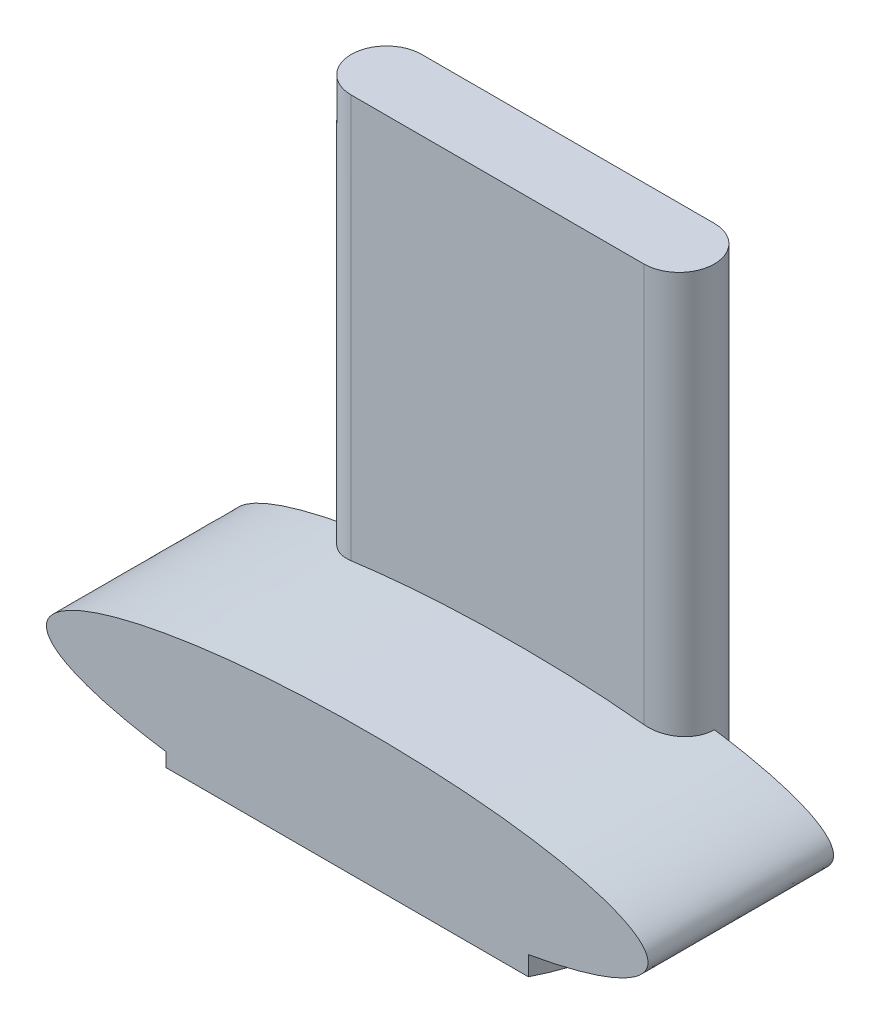
ISO-10303-21;
HEADER;
FILE_DESCRIPTION(('STEP AP214'),'2;1');
FILE_NAME('part.step','',(''),(''),'','','');
FILE_SCHEMA(('AUTOMOTIVE_DESIGN { 1 0 10303 214 1 1 1 1 }'));
ENDSEC;
DATA;
#1=APPLICATION_CONTEXT('core data for automotive mechanical design processes');
#2=APPLICATION_PROTOCOL_DEFINITION('international standard','automotive_design',2000,#1);
#3=PRODUCT_CONTEXT('',#1,'mechanical');
#4=PRODUCT('Part','Part','',(#3));
#5=PRODUCT_RELATED_PRODUCT_CATEGORY('part','',(#4));
#6=PRODUCT_DEFINITION_FORMATION('','',#4);
#7=PRODUCT_DEFINITION_CONTEXT('part definition',#1,'design');
#8=PRODUCT_DEFINITION('design','',#6,#7);
#9=PRODUCT_DEFINITION_SHAPE('','',#8);
#10=(LENGTH_UNIT() NAMED_UNIT(*) SI_UNIT(.MILLI.,.METRE.));
#11=(NAMED_UNIT(*) PLANE_ANGLE_UNIT() SI_UNIT($,.RADIAN.));
#12=(NAMED_UNIT(*) SI_UNIT($,.STERADIAN.) SOLID_ANGLE_UNIT());
#13=UNCERTAINTY_MEASURE_WITH_UNIT(LENGTH_MEASURE(1.E-05),#10,'distance_accuracy_value','');
#14=(GEOMETRIC_REPRESENTATION_CONTEXT(3) GLOBAL_UNCERTAINTY_ASSIGNED_CONTEXT((#13)) GLOBAL_UNIT_ASSIGNED_CONTEXT((#10,
#11,#12)) REPRESENTATION_CONTEXT('',''));
#15=CARTESIAN_POINT('',(0.,0.,0.));
#16=DIRECTION('',(0.,0.,1.));
#17=DIRECTION('',(1.,0.,0.));
#18=AXIS2_PLACEMENT_3D('',#15,#16,#17);
#19=CARTESIAN_POINT('',(-67.802373163856,6.57126359990257,29.));
#20=DIRECTION('',(0.,0.,1.));
#21=DIRECTION('',(0.999874210154372,0.015860765056315,0.));
#22=AXIS2_PLACEMENT_3D('',#19,#20,#21);
#23=ELLIPSE('',#22,47.0059128665231,10.001258056707);
#24=DIRECTION('',(0.,0.,-1.));
#25=VECTOR('',#24,1.);
#26=SURFACE_OF_LINEAR_EXTRUSION('',#23,#25);
#27=CARTESIAN_POINT('',(-67.802373163856,6.57126359990257,0.));
#28=DIRECTION('',(0.,0.,1.));
#29=DIRECTION('',(0.999874210154372,0.015860765056315,0.));
#30=AXIS2_PLACEMENT_3D('',#27,#28,#29);
#31=ELLIPSE('',#30,47.0059128665231,10.001258056707);
#32=CARTESIAN_POINT('',(-39.4963550923296,-0.985077744393621,0.));
#33=VERTEX_POINT('',#32);
#34=CARTESIAN_POINT('',(-39.4323803621719,14.9756447772538,0.));
#35=VERTEX_POINT('',#34);
#36=EDGE_CURVE('E209',#33,#35,#31,.T.);
#37=ORIENTED_EDGE('',*,*,#36,.T.);
#38=CARTESIAN_POINT('',(-39.4323803621719,14.9756447772538,0.));
#39=CARTESIAN_POINT('',(-39.4323628763597,14.9756398915962,0.1536177940177));
#40=CARTESIAN_POINT('',(-39.4388158718519,14.9765841507698,0.307232402073417));
#41=CARTESIAN_POINT('',(-39.4645360192316,14.9803355381872,0.613351089704219));
#42=CARTESIAN_POINT('',(-39.4838022098335,14.9831425266833,0.765855251720767));
#43=CARTESIAN_POINT('',(-39.5349938035824,14.9905798689408,1.06850570471066));
#44=CARTESIAN_POINT('',(-39.5669052573059,14.9952082134631,1.21865440496776));
#45=CARTESIAN_POINT('',(-39.6431414246942,15.0062200996859,1.51569908695471));
#46=CARTESIAN_POINT('',(-39.6874660543734,15.0126036295111,1.66259509068451));
#47=CARTESIAN_POINT('',(-39.7882068157047,15.0270370882057,1.95212230248194));
#48=CARTESIAN_POINT('',(-39.8446248952141,15.0350872855133,2.09475281929768));
#49=CARTESIAN_POINT('',(-39.9691530269713,15.0527451245116,2.37477749467878));
#50=CARTESIAN_POINT('',(-40.0372673935081,15.0623533408195,2.51216969810749));
#51=CARTESIAN_POINT('',(-40.184641400445,15.0829909663263,2.78064754877124));
#52=CARTESIAN_POINT('',(-40.2638960517047,15.0940197391496,2.9117359840493));
#53=CARTESIAN_POINT('',(-40.4330308520631,15.1173622329959,3.16681717390972));
#54=CARTESIAN_POINT('',(-40.5229149308546,15.1296764290405,3.29080727894415));
#55=CARTESIAN_POINT('',(-40.7131184303007,15.1554961189407,3.53139598410666));
#56=CARTESIAN_POINT('',(-40.8134880000321,15.1690072860112,3.64795432820888));
#57=CARTESIAN_POINT('',(-41.0236042780639,15.1970073462977,3.87223656767038));
#58=CARTESIAN_POINT('',(-41.1333542340609,15.2114965777732,3.97995737777545));
#59=CARTESIAN_POINT('',(-41.3614281948898,15.2412797147566,4.18578989705671));
#60=CARTESIAN_POINT('',(-41.4797525180193,15.256573650131,4.2839012491924));
#61=CARTESIAN_POINT('',(-41.7241411165379,15.2877952188973,4.46984529409507));
#62=CARTESIAN_POINT('',(-41.8502054578212,15.3037228576837,4.55767789933602));
#63=CARTESIAN_POINT('',(-42.1104006980702,15.3361934658205,4.72323572714627));
#64=CARTESIAN_POINT('',(-42.2445957068343,15.3527407798355,4.80085936648686));
#65=CARTESIAN_POINT('',(-42.5189791424371,15.3861340986382,4.94446857374388));
#66=CARTESIAN_POINT('',(-42.6591655602181,15.4029800022101,5.01045800542338));
#67=CARTESIAN_POINT('',(-42.9445604191956,15.4368103091887,5.13035917651596));
#68=CARTESIAN_POINT('',(-43.0897675984394,15.4537946769844,5.18427392575244));
#69=CARTESIAN_POINT('',(-43.3841548643923,15.4877457078569,5.27965694503957));
#70=CARTESIAN_POINT('',(-43.5333340538545,15.5047123740473,5.32112800048769));
#71=CARTESIAN_POINT('',(-43.888480846632,15.5445212108886,5.40387177639771));
#72=CARTESIAN_POINT('',(-44.095737951612,15.5673021629479,5.43980551328131));
#73=CARTESIAN_POINT('',(-44.4084731660432,15.6009877941238,5.47574726039013));
#74=CARTESIAN_POINT('',(-44.5129791988911,15.6121304815873,5.48473468892212));
#75=CARTESIAN_POINT('',(-44.722345548559,15.6342272655959,5.49672274895402));
#76=CARTESIAN_POINT('',(-44.8272058365812,15.6451813770493,5.49972385589009));
#77=CARTESIAN_POINT('',(-44.9321054761412,15.6560269402788,5.49972511396923));
#78=B_SPLINE_CURVE_WITH_KNOTS('',3,(#38,#39,#40,#41,#42,#43,#44,#45,#46,#47,#48,#49,#50,#51,#52,
#53,#54,#55,#56,#57,#58,#59,#60,#61,#62,#63,#64,#65,#66,#67,#68,#69,#70,#71,#72,#73,#74,#75,#76,
#77),.UNSPECIFIED.,.F.,.F.,(4,2,2,2,2,2,2,2,2,2,2,2,2,2,2,2,2,2,2,4),(0.,0.460710364159492,
0.921386168302653,1.38155519360577,1.84172110555541,2.30196119087898,2.7623714063315,
3.22257608164276,3.68295142937163,4.14563925104148,4.60848791942732,5.07135377848889,
5.53422357867911,6.00139759208489,6.46841616182551,6.93531818922261,7.40211562713205,
8.03528914148741,8.35159222295398,8.66787018249702),.UNSPECIFIED.);
#79=CARTESIAN_POINT('',(-44.9321054761412,15.6560269402788,5.49972511396923));
#80=VERTEX_POINT('',#79);
#81=EDGE_CURVE('E157',#35,#80,#78,.T.);
#82=ORIENTED_EDGE('',*,*,#81,.T.);
#83=CARTESIAN_POINT('',(-67.802373163856,6.57126359990257,5.49972511396924));
#84=DIRECTION('',(0.,0.,1.));
#85=DIRECTION('',(0.999874210154372,0.015860765056315,0.));
#86=AXIS2_PLACEMENT_3D('',#83,#84,#85);
#87=ELLIPSE('',#86,47.0059128665231,10.001258056707);
#88=CARTESIAN_POINT('',(-90.6726408515708,14.9633098128657,5.49972511396923));
#89=VERTEX_POINT('',#88);
#90=EDGE_CURVE('E11',#80,#89,#87,.T.);
#91=ORIENTED_EDGE('',*,*,#90,.T.);
#92=CARTESIAN_POINT('',(-90.6726408515707,14.9633098128657,5.49972511396923));
#93=CARTESIAN_POINT('',(-90.8287894917864,14.942438240365,5.49974106665658));
#94=CARTESIAN_POINT('',(-90.9849014069268,14.9213182575938,5.49307573674945));
#95=CARTESIAN_POINT('',(-91.2959409542856,14.8787391772076,5.46651511223668));
#96=CARTESIAN_POINT('',(-91.4508686502114,14.8572800980283,5.44662053446519));
#97=CARTESIAN_POINT('',(-91.7583511452549,14.8141915392567,5.39375031243677));
#98=CARTESIAN_POINT('',(-91.9109073502225,14.7925621730384,5.36078275128843));
#99=CARTESIAN_POINT('',(-92.2126648250226,14.7492913581343,5.28200858226579));
#100=CARTESIAN_POINT('',(-92.3618661241227,14.7276499095556,5.23620208644296));
#101=CARTESIAN_POINT('',(-92.655899888991,14.684529743664,5.13205544856516));
#102=CARTESIAN_POINT('',(-92.8007311398658,14.6630510728245,5.07371185709269));
#103=CARTESIAN_POINT('',(-93.0850067426607,14.620445225195,4.94487901203998));
#104=CARTESIAN_POINT('',(-93.2244490897679,14.5993181808522,4.8743852905437));
#105=CARTESIAN_POINT('',(-93.4968223213544,14.5576331969927,4.72179311461037));
#106=CARTESIAN_POINT('',(-93.6297566601865,14.5370749581388,4.63970090840239));
#107=CARTESIAN_POINT('',(-93.888284334304,14.4967121784314,4.46441618501942));
#108=CARTESIAN_POINT('',(-94.0138751167907,14.4769079004978,4.37121984157477));
#109=CARTESIAN_POINT('',(-94.2565407928738,14.4383010199571,4.17456400861228));
#110=CARTESIAN_POINT('',(-94.3736302619677,14.4194967184524,4.07112284017423));
#111=CARTESIAN_POINT('',(-94.5986778617724,14.3830578605448,3.85455525677086));
#112=CARTESIAN_POINT('',(-94.7066360836598,14.3654232924624,3.74142893853552));
#113=CARTESIAN_POINT('',(-94.912658077973,14.3315193396208,3.50623435087799));
#114=CARTESIAN_POINT('',(-95.0107182464504,14.3152504524758,3.38416285217736));
#115=CARTESIAN_POINT('',(-95.1961253270447,14.2842853709671,3.13201904662795));
#116=CARTESIAN_POINT('',(-95.2834761624083,14.2695886009286,3.00194969608265));
#117=CARTESIAN_POINT('',(-95.4460754285671,14.2420727765695,2.73594069325539));
#118=CARTESIAN_POINT('',(-95.5214289396378,14.2292375179248,2.60006695006741));
#119=CARTESIAN_POINT('',(-95.6604013922599,14.2054508564834,2.32235282009532));
#120=CARTESIAN_POINT('',(-95.7240248457144,14.1944987294601,2.18051475334541));
#121=CARTESIAN_POINT('',(-95.8390528477802,14.1746201206243,1.89189858837072));
#122=CARTESIAN_POINT('',(-95.8904628859657,14.1656927288346,1.74512274352856));
#123=CARTESIAN_POINT('',(-95.9806819632226,14.1499795654156,1.44769894617591));
#124=CARTESIAN_POINT('',(-96.019494501593,14.1431931990727,1.29705208151592));
#125=CARTESIAN_POINT('',(-96.091889692171,14.1305102605303,0.956895566299315));
#126=CARTESIAN_POINT('',(-96.1220653345111,14.1252035743663,0.766619881462864));
#127=CARTESIAN_POINT('',(-96.1522411701397,14.1198924787905,0.479796159374986));
#128=CARTESIAN_POINT('',(-96.1597851696203,14.1185636061095,0.384001884154117));
#129=CARTESIAN_POINT('',(-96.1698471994573,14.1167905874531,0.192145462578599));
#130=CARTESIAN_POINT('',(-96.172365434021,14.1163464055308,0.0960833272664957));
#131=CARTESIAN_POINT('',(-96.17236596554,14.1163465745979,0.));
#132=B_SPLINE_CURVE_WITH_KNOTS('',3,(#92,#93,#94,#95,#96,#97,#98,#99,#100,#101,#102,#103,#104,
#105,#106,#107,#108,#109,#110,#111,#112,#113,#114,#115,#116,#117,#118,#119,#120,#121,#122,#123,
#124,#125,#126,#127,#128,#129,#130,#131),.UNSPECIFIED.,.F.,.F.,(4,2,2,2,2,2,2,2,2,2,2,2,2,2,2,2,
2,2,2,4),(0.,0.47246603569891,0.944906472648879,1.41705525102002,1.88919990885325,
2.3614746378097,2.8339234063315,3.30611862521426,3.77847702652264,4.2500054481597,
4.72152916097761,5.19322394412417,5.66474540742437,6.13187799076186,6.59883051750325,
7.0655727639186,7.53218524877262,8.10913712898271,8.39732254733615,8.68549625587474),.UNSPECIFIED.);
#133=CARTESIAN_POINT('',(-96.17236596554,14.1163465745979,0.));
#134=VERTEX_POINT('',#133);
#135=EDGE_CURVE('E146',#89,#134,#132,.T.);
#136=ORIENTED_EDGE('',*,*,#135,.T.);
#137=CARTESIAN_POINT('',(-96.1083912353824,-1.84243821759632,0.));
#138=VERTEX_POINT('',#137);
#139=EDGE_CURVE('E204',#134,#138,#31,.T.);
#140=ORIENTED_EDGE('',*,*,#139,.T.);
#141=CARTESIAN_POINT('',(-96.1083912353824,-1.84243821759631,0.));
#142=CARTESIAN_POINT('',(-96.3787061553993,-1.80313106264265,0.527653474716979));
#143=CARTESIAN_POINT('',(-96.634272406827,-1.76499524564741,1.06295269889966));
#144=CARTESIAN_POINT('',(-97.1151731271862,-1.69171109355644,2.14719289199587));
#145=CARTESIAN_POINT('',(-97.3405061373446,-1.65656290264552,2.69613451765032));
#146=CARTESIAN_POINT('',(-97.760182382735,-1.58990230067459,3.80596560465421));
#147=CARTESIAN_POINT('',(-97.9545252231299,-1.55838993593903,4.36685521812638));
#148=CARTESIAN_POINT('',(-98.3113742933346,-1.49963896182198,5.49817337863625));
#149=CARTESIAN_POINT('',(-98.4739173335546,-1.4723954183559,6.06859005691042));
#150=CARTESIAN_POINT('',(-98.7668969390914,-1.42268386142012,7.21779277357566));
#151=CARTESIAN_POINT('',(-98.8973347872416,-1.40021565714617,7.79657847658527));
#152=CARTESIAN_POINT('',(-99.1256650892055,-1.36052036034911,8.96069877933141));
#153=CARTESIAN_POINT('',(-99.2235583436587,-1.34329313889186,9.54603321759425));
#154=CARTESIAN_POINT('',(-99.3864268674395,-1.31445475823029,10.7211259166934));
#155=CARTESIAN_POINT('',(-99.4514173636997,-1.30284100130661,11.3108820027799));
#156=CARTESIAN_POINT('',(-99.5483224188973,-1.28547168782074,12.4932118089129));
#157=CARTESIAN_POINT('',(-99.580235881807,-1.27971632538017,13.085785621673));
#158=CARTESIAN_POINT('',(-99.6108709078056,-1.27419218746167,14.271838211913));
#159=CARTESIAN_POINT('',(-99.6095913688794,-1.27442361074639,14.8653170187847));
#160=CARTESIAN_POINT('',(-99.5738488410773,-1.28086718869124,16.0510129489555));
#161=CARTESIAN_POINT('',(-99.5393986763578,-1.28707703202334,16.6432304712052));
#162=CARTESIAN_POINT('',(-99.4374581832261,-1.30533575676804,17.8246981126517));
#163=CARTESIAN_POINT('',(-99.3699690807325,-1.31738442152946,18.4139483411312));
#164=CARTESIAN_POINT('',(-99.2021953622608,-1.34705629345615,19.587545544435));
#165=CARTESIAN_POINT('',(-99.101915436216,-1.36467870342033,20.1718932082011));
#166=CARTESIAN_POINT('',(-98.8896228875534,-1.40152548158917,21.2306022052652));
#167=CARTESIAN_POINT('',(-98.7828625679042,-1.41990857531949,21.706054272864));
#168=CARTESIAN_POINT('',(-98.5476639514413,-1.45992745408832,22.6513770228823));
#169=CARTESIAN_POINT('',(-98.4192281749477,-1.48156286093124,23.1212483474132));
#170=CARTESIAN_POINT('',(-98.1409686390083,-1.52779286607082,24.0544412483459));
#171=CARTESIAN_POINT('',(-97.9911458172875,-1.5523873346186,24.5177631109334));
#172=CARTESIAN_POINT('',(-97.6704367833484,-1.6042141294824,25.4369273699679));
#173=CARTESIAN_POINT('',(-97.4995498117459,-1.63144655089174,25.8927694960909));
#174=CARTESIAN_POINT('',(-97.1370809951693,-1.68820616567573,26.7960306232352));
#175=CARTESIAN_POINT('',(-96.9454980878858,-1.71773347682379,27.243449190495));
#176=CARTESIAN_POINT('',(-96.5420493393577,-1.77872423144845,28.1289601260711));
#177=CARTESIAN_POINT('',(-96.3301816846153,-1.81018784794469,28.5670516562435));
#178=CARTESIAN_POINT('',(-96.1083912353824,-1.84243821759632,29.));
#179=B_SPLINE_CURVE_WITH_KNOTS('',3,(#141,#142,#143,#144,#145,#146,#147,#148,#149,#150,#151,
#152,#153,#154,#155,#156,#157,#158,#159,#160,#161,#162,#163,#164,#165,#166,#167,#168,#169,#170,
#171,#172,#173,#174,#175,#176,#177,#178),.UNSPECIFIED.,.F.,.F.,(4,2,2,2,2,2,2,2,2,2,2,2,2,2,2,2,
2,2,4),(0.,1.78227019150067,3.5646263477633,5.34700521070719,7.12730848109377,8.90754060400498,
10.6877289276367,12.4670926503944,14.2465153315776,16.0259970900743,17.8047911559935,
19.5835192242861,21.3619929997915,22.8244006579638,24.2866383912614,25.7488120317425,
27.2110384005131,28.6733398601445,30.1357721747958),.UNSPECIFIED.);
#180=CARTESIAN_POINT('',(-96.1083912353824,-1.84243821759632,29.));
#181=VERTEX_POINT('',#180);
#182=EDGE_CURVE('E196',#138,#181,#179,.T.);
#183=ORIENTED_EDGE('',*,*,#182,.T.);
#184=CARTESIAN_POINT('',(-39.4963550923296,-0.985077744393621,29.));
#185=VERTEX_POINT('',#184);
#186=EDGE_CURVE('E205',#185,#181,#23,.T.);
#187=ORIENTED_EDGE('',*,*,#186,.F.);
#188=CARTESIAN_POINT('',(-39.4963550923296,-0.985077744393617,29.));
#189=CARTESIAN_POINT('',(-39.2267592991775,-0.937709498426134,28.4737501433797));
#190=CARTESIAN_POINT('',(-38.9718095282264,-0.891946219768346,27.939847736244));
#191=CARTESIAN_POINT('',(-38.491941555861,-0.804292977801077,26.8583558504458));
#192=CARTESIAN_POINT('',(-38.2670256026138,-0.762403304520555,26.3107653508059));
#193=CARTESIAN_POINT('',(-37.8480011614249,-0.683167147875868,25.2035834628068));
#194=CARTESIAN_POINT('',(-37.6538932903621,-0.64582075548659,24.6439918344001));
#195=CARTESIAN_POINT('',(-37.2973583458593,-0.576336259878335,23.5152414109884));
#196=CARTESIAN_POINT('',(-37.1348928181462,-0.544191842947347,22.9460951532717));
#197=CARTESIAN_POINT('',(-36.8419145934276,-0.485619032708464,21.7993734396766));
#198=CARTESIAN_POINT('',(-36.7114003849673,-0.459190369024184,21.2217983838921));
#199=CARTESIAN_POINT('',(-36.4827767079221,-0.412528804524178,20.0600371486413));
#200=CARTESIAN_POINT('',(-36.3846663388967,-0.392295731546022,19.4758511533471));
#201=CARTESIAN_POINT('',(-36.2213230604641,-0.358431566350021,18.3036284770183));
#202=CARTESIAN_POINT('',(-36.1560397023705,-0.344790345013316,17.7155991201823));
#203=CARTESIAN_POINT('',(-36.0583583849448,-0.324325779287724,16.536675265631));
#204=CARTESIAN_POINT('',(-36.0259615803038,-0.317502674292192,15.9457806680451));
#205=CARTESIAN_POINT('',(-35.9941753913235,-0.31080850151804,14.7630462093289));
#206=CARTESIAN_POINT('',(-35.9947870511924,-0.310937653670978,14.171206318887));
#207=CARTESIAN_POINT('',(-36.029012129679,-0.318144749358183,12.9887403606397));
#208=CARTESIAN_POINT('',(-36.0626134660448,-0.325220148875038,12.3981139277724));
#209=CARTESIAN_POINT('',(-36.1626743450431,-0.346177087739693,11.2197977784981));
#210=CARTESIAN_POINT('',(-36.2291327203842,-0.360058385298475,10.632107958513));
#211=CARTESIAN_POINT('',(-36.3946588038828,-0.394358758113034,9.46160390769688));
#212=CARTESIAN_POINT('',(-36.4937219591258,-0.414776920553525,8.87878900777947));
#213=CARTESIAN_POINT('',(-36.7045117718481,-0.457771255093309,7.81837019931998));
#214=CARTESIAN_POINT('',(-36.8112231457452,-0.479390566461174,7.33972289650201));
#215=CARTESIAN_POINT('',(-37.046593724771,-0.52659411450832,6.38810178768259));
#216=CARTESIAN_POINT('',(-37.1752504946754,-0.552177911230019,5.91512735840311));
#217=CARTESIAN_POINT('',(-37.4542084199117,-0.607001706827669,4.97584281807803));
#218=CARTESIAN_POINT('',(-37.6045087665566,-0.636241569093617,4.50953245875247));
#219=CARTESIAN_POINT('',(-37.9264219303129,-0.698040575434037,3.58450399451626));
#220=CARTESIAN_POINT('',(-38.0980366566609,-0.730600016813111,3.12578657392024));
#221=CARTESIAN_POINT('',(-38.4621864222104,-0.798674684322599,2.21693313909964));
#222=CARTESIAN_POINT('',(-38.6547224040674,-0.834190043621816,1.76679751262258));
#223=CARTESIAN_POINT('',(-39.060283278193,-0.907797158744196,0.876029568318825));
#224=CARTESIAN_POINT('',(-39.2733095957942,-0.945889093742301,0.43539791421375));
#225=CARTESIAN_POINT('',(-39.4963550923296,-0.985077744393619,0.));
#226=B_SPLINE_CURVE_WITH_KNOTS('',3,(#188,#189,#190,#191,#192,#193,#194,#195,#196,#197,#198,
#199,#200,#201,#202,#203,#204,#205,#206,#207,#208,#209,#210,#211,#212,#213,#214,#215,#216,#217,
#218,#219,#220,#221,#222,#223,#224,#225),.UNSPECIFIED.,.F.,.F.,(4,2,2,2,2,2,2,2,2,2,2,2,2,2,2,2,
2,2,4),(0.,1.77932084029831,3.5587747962296,5.3382643781739,7.11557770193592,8.89280693376968,
10.6699867756598,12.4444270285705,14.2189295823075,15.9934882716755,17.7673972829572,
19.5412432782139,21.3148416795502,22.7869450761662,24.2588852233857,25.7307703875398,
27.2027874910946,28.6748709472949,30.1470568775562),.UNSPECIFIED.);
#227=EDGE_CURVE('E189',#185,#33,#226,.T.);
#228=ORIENTED_EDGE('',*,*,#227,.T.);
#229=EDGE_LOOP('',(#37,#82,#91,#136,#140,#183,#187,#228));
#230=FACE_BOUND('',#229,.T.);
#231=ADVANCED_FACE('F33',(#230),#26,.F.);
#232=CARTESIAN_POINT('',(-67.802373163856,6.57126359990257,29.));
#233=DIRECTION('',(0.,0.,1.));
#234=DIRECTION('',(1.,0.,0.));
#235=AXIS2_PLACEMENT_3D('',#232,#233,#234);
#236=PLANE('',#235);
#237=ORIENTED_EDGE('',*,*,#186,.T.);
#238=DIRECTION('',(0.,1.,0.));
#239=VECTOR('',#238,1.);
#240=CARTESIAN_POINT('',(-96.1083912353824,-4.,29.));
#241=LINE('',#240,#239);
#242=CARTESIAN_POINT('',(-96.1083912353824,-4.,29.));
#243=VERTEX_POINT('',#242);
#244=EDGE_CURVE('E198',#243,#181,#241,.T.);
#245=ORIENTED_EDGE('',*,*,#244,.F.);
#246=DIRECTION('',(1.,0.,0.));
#247=VECTOR('',#246,1.);
#248=CARTESIAN_POINT('',(-96.1083912353824,-4.,29.));
#249=LINE('',#248,#247);
#250=CARTESIAN_POINT('',(-39.4963550923296,-4.,29.));
#251=VERTEX_POINT('',#250);
#252=EDGE_CURVE('E235',#243,#251,#249,.T.);
#253=ORIENTED_EDGE('',*,*,#252,.T.);
#254=DIRECTION('',(0.,1.,0.));
#255=VECTOR('',#254,1.);
#256=CARTESIAN_POINT('',(-39.4963550923296,-4.,29.));
#257=LINE('',#256,#255);
#258=EDGE_CURVE('E57',#251,#185,#257,.T.);
#259=ORIENTED_EDGE('',*,*,#258,.T.);
#260=EDGE_LOOP('',(#237,#245,#253,#259));
#261=FACE_BOUND('',#260,.T.);
#262=ADVANCED_FACE('F253',(#261),#236,.T.);
#263=CARTESIAN_POINT('',(-67.802373163856,6.57126359990257,0.));
#264=DIRECTION('',(0.,0.,1.));
#265=DIRECTION('',(1.,0.,0.));
#266=AXIS2_PLACEMENT_3D('',#263,#264,#265);
#267=PLANE('',#266);
#268=DIRECTION('',(1.,0.,0.));
#269=VECTOR('',#268,1.);
#270=CARTESIAN_POINT('',(-67.802373163856,7.999999876,0.));
#271=LINE('',#270,#269);
#272=CARTESIAN_POINT('',(-96.17236596554,7.999999876,0.));
#273=VERTEX_POINT('',#272);
#274=CARTESIAN_POINT('',(-39.4323803621719,7.999999876,0.));
#275=VERTEX_POINT('',#274);
#276=EDGE_CURVE('E208',#273,#275,#271,.T.);
#277=ORIENTED_EDGE('',*,*,#276,.T.);
#278=DIRECTION('',(0.,-1.,0.));
#279=VECTOR('',#278,1.);
#280=CARTESIAN_POINT('',(-39.4323803621719,77.999999876,0.));
#281=LINE('',#280,#279);
#282=EDGE_CURVE('E42',#275,#35,#281,.F.);
#283=ORIENTED_EDGE('',*,*,#282,.T.);
#284=ORIENTED_EDGE('',*,*,#36,.F.);
#285=DIRECTION('',(0.,1.,0.));
#286=VECTOR('',#285,1.);
#287=CARTESIAN_POINT('',(-39.4963550923296,-4.,0.));
#288=LINE('',#287,#286);
#289=CARTESIAN_POINT('',(-39.4963550923296,-4.,0.));
#290=VERTEX_POINT('',#289);
#291=EDGE_CURVE('E224',#290,#33,#288,.T.);
#292=ORIENTED_EDGE('',*,*,#291,.F.);
#293=DIRECTION('',(-1.,0.,0.));
#294=VECTOR('',#293,1.);
#295=CARTESIAN_POINT('',(-39.4963550923296,-4.,0.));
#296=LINE('',#295,#294);
#297=CARTESIAN_POINT('',(-96.1083912353824,-4.,0.));
#298=VERTEX_POINT('',#297);
#299=EDGE_CURVE('E232',#290,#298,#296,.T.);
#300=ORIENTED_EDGE('',*,*,#299,.T.);
#301=DIRECTION('',(0.,1.,0.));
#302=VECTOR('',#301,1.);
#303=CARTESIAN_POINT('',(-96.1083912353824,-4.,0.));
#304=LINE('',#303,#302);
#305=EDGE_CURVE('E197',#298,#138,#304,.T.);
#306=ORIENTED_EDGE('',*,*,#305,.T.);
#307=ORIENTED_EDGE('',*,*,#139,.F.);
#308=DIRECTION('',(0.,-1.,0.));
#309=VECTOR('',#308,1.);
#310=CARTESIAN_POINT('',(-96.17236596554,77.999999876,0.));
#311=LINE('',#310,#309);
#312=EDGE_CURVE('E214',#134,#273,#311,.T.);
#313=ORIENTED_EDGE('',*,*,#312,.T.);
#314=EDGE_LOOP('',(#277,#283,#284,#292,#300,#306,#307,#313));
#315=FACE_BOUND('',#314,.T.);
#316=ADVANCED_FACE('F219',(#315),#267,.F.);
#317=CARTESIAN_POINT('',(-67.802373163856,-4.,14.5));
#318=DIRECTION('',(0.,1.,0.));
#319=DIRECTION('',(0.,0.,1.));
#320=AXIS2_PLACEMENT_3D('',#317,#318,#319);
#321=CYLINDRICAL_SURFACE('',#320,31.8037837224689);
#322=ORIENTED_EDGE('',*,*,#182,.F.);
#323=ORIENTED_EDGE('',*,*,#305,.F.);
#324=CARTESIAN_POINT('',(-67.802373163856,-4.,14.5));
#325=DIRECTION('',(0.,1.,0.));
#326=DIRECTION('',(0.,0.,1.));
#327=AXIS2_PLACEMENT_3D('',#324,#325,#326);
#328=CIRCLE('',#327,31.8037837224689);
#329=EDGE_CURVE('E236',#298,#243,#328,.T.);
#330=ORIENTED_EDGE('',*,*,#329,.T.);
#331=ORIENTED_EDGE('',*,*,#244,.T.);
#332=EDGE_LOOP('',(#322,#323,#330,#331));
#333=FACE_BOUND('',#332,.T.);
#334=ADVANCED_FACE('F184',(#333),#321,.T.);
#335=CARTESIAN_POINT('',(-67.802373163856,-4.,14.5));
#336=DIRECTION('',(0.,1.,0.));
#337=DIRECTION('',(0.,0.,1.));
#338=AXIS2_PLACEMENT_3D('',#335,#336,#337);
#339=CYLINDRICAL_SURFACE('',#338,31.8037837224689);
#340=ORIENTED_EDGE('',*,*,#227,.F.);
#341=ORIENTED_EDGE('',*,*,#258,.F.);
#342=CARTESIAN_POINT('',(-67.802373163856,-4.,14.5));
#343=DIRECTION('',(0.,1.,0.));
#344=DIRECTION('',(0.,0.,1.));
#345=AXIS2_PLACEMENT_3D('',#342,#343,#344);
#346=CIRCLE('',#345,31.8037837224689);
#347=EDGE_CURVE('E225',#251,#290,#346,.T.);
#348=ORIENTED_EDGE('',*,*,#347,.T.);
#349=ORIENTED_EDGE('',*,*,#291,.T.);
#350=EDGE_LOOP('',(#340,#341,#348,#349));
#351=FACE_BOUND('',#350,.T.);
#352=ADVANCED_FACE('F179',(#351),#339,.T.);
#353=CARTESIAN_POINT('',(-67.802373163856,-4.,14.5));
#354=DIRECTION('',(0.,1.,0.));
#355=DIRECTION('',(0.,0.,1.));
#356=AXIS2_PLACEMENT_3D('',#353,#354,#355);
#357=PLANE('',#356);
#358=ORIENTED_EDGE('',*,*,#329,.F.);
#359=ORIENTED_EDGE('',*,*,#299,.F.);
#360=ORIENTED_EDGE('',*,*,#347,.F.);
#361=ORIENTED_EDGE('',*,*,#252,.F.);
#362=EDGE_LOOP('',(#358,#359,#360,#361));
#363=FACE_BOUND('',#362,.T.);
#364=ADVANCED_FACE('F173',(#363),#357,.F.);
#365=CARTESIAN_POINT('',(-44.9321054761412,77.999999876,5.49972511396923));
#366=DIRECTION('',(0.,0.,1.));
#367=DIRECTION('',(1.,0.,0.));
#368=AXIS2_PLACEMENT_3D('',#365,#366,#367);
#369=PLANE('',#368);
#370=ORIENTED_EDGE('',*,*,#90,.F.);
#371=DIRECTION('',(0.,-1.,0.));
#372=VECTOR('',#371,1.);
#373=CARTESIAN_POINT('',(-44.9321054761412,77.999999876,5.49972511396923));
#374=LINE('',#373,#372);
#375=CARTESIAN_POINT('',(-44.9321054761412,77.999999876,5.49972511396923));
#376=VERTEX_POINT('',#375);
#377=EDGE_CURVE('E113',#376,#80,#374,.T.);
#378=ORIENTED_EDGE('',*,*,#377,.F.);
#379=DIRECTION('',(-1.,0.,0.));
#380=VECTOR('',#379,1.);
#381=CARTESIAN_POINT('',(-44.9321054761412,77.999999876,5.49972511396923));
#382=LINE('',#381,#380);
#383=CARTESIAN_POINT('',(-90.6726408515708,77.999999876,5.49972511396923));
#384=VERTEX_POINT('',#383);
#385=EDGE_CURVE('E117',#376,#384,#382,.T.);
#386=ORIENTED_EDGE('',*,*,#385,.T.);
#387=DIRECTION('',(0.,-1.,0.));
#388=VECTOR('',#387,1.);
#389=CARTESIAN_POINT('',(-90.6726408515708,77.999999876,5.49972511396923));
#390=LINE('',#389,#388);
#391=EDGE_CURVE('E121',#384,#89,#390,.T.);
#392=ORIENTED_EDGE('',*,*,#391,.T.);
#393=EDGE_LOOP('',(#370,#378,#386,#392));
#394=FACE_BOUND('',#393,.T.);
#395=ADVANCED_FACE('F115',(#394),#369,.T.);
#396=CARTESIAN_POINT('',(-44.9321054761412,77.999999876,0.));
#397=DIRECTION('',(0.,-1.,0.));
#398=DIRECTION('',(0.,0.,-1.));
#399=AXIS2_PLACEMENT_3D('',#396,#397,#398);
#400=CYLINDRICAL_SURFACE('',#399,5.49972511396923);
#401=ORIENTED_EDGE('',*,*,#81,.F.);
#402=ORIENTED_EDGE('',*,*,#282,.F.);
#403=CARTESIAN_POINT('',(-44.9321054761412,7.999999876,0.));
#404=DIRECTION('',(0.,-1.,0.));
#405=DIRECTION('',(0.,0.,-1.));
#406=AXIS2_PLACEMENT_3D('',#403,#404,#405);
#407=CIRCLE('',#406,5.49972511396923);
#408=CARTESIAN_POINT('',(-44.9321054761412,7.999999876,-5.49972511396923));
#409=VERTEX_POINT('',#408);
#410=EDGE_CURVE('E49',#409,#275,#407,.T.);
#411=ORIENTED_EDGE('',*,*,#410,.F.);
#412=DIRECTION('',(0.,-1.,0.));
#413=VECTOR('',#412,1.);
#414=CARTESIAN_POINT('',(-44.9321054761412,77.999999876,-5.49972511396923));
#415=LINE('',#414,#413);
#416=CARTESIAN_POINT('',(-44.9321054761412,77.999999876,-5.49972511396923));
#417=VERTEX_POINT('',#416);
#418=EDGE_CURVE('E135',#417,#409,#415,.T.);
#419=ORIENTED_EDGE('',*,*,#418,.F.);
#420=CARTESIAN_POINT('',(-44.9321054761412,77.999999876,0.));
#421=DIRECTION('',(0.,-1.,0.));
#422=DIRECTION('',(0.,0.,-1.));
#423=AXIS2_PLACEMENT_3D('',#420,#421,#422);
#424=CIRCLE('',#423,5.49972511396923);
#425=EDGE_CURVE('E129',#417,#376,#424,.T.);
#426=ORIENTED_EDGE('',*,*,#425,.T.);
#427=ORIENTED_EDGE('',*,*,#377,.T.);
#428=EDGE_LOOP('',(#401,#402,#411,#419,#426,#427));
#429=FACE_BOUND('',#428,.T.);
#430=ADVANCED_FACE('F134',(#429),#400,.T.);
#431=CARTESIAN_POINT('',(-90.6726408515708,77.999999876,0.));
#432=DIRECTION('',(0.,-1.,0.));
#433=DIRECTION('',(0.,0.,-1.));
#434=AXIS2_PLACEMENT_3D('',#431,#432,#433);
#435=CYLINDRICAL_SURFACE('',#434,5.49972511396923);
#436=ORIENTED_EDGE('',*,*,#135,.F.);
#437=ORIENTED_EDGE('',*,*,#391,.F.);
#438=CARTESIAN_POINT('',(-90.6726408515708,77.999999876,0.));
#439=DIRECTION('',(0.,-1.,0.));
#440=DIRECTION('',(0.,0.,-1.));
#441=AXIS2_PLACEMENT_3D('',#438,#439,#440);
#442=CIRCLE('',#441,5.49972511396923);
#443=CARTESIAN_POINT('',(-90.6726408515708,77.999999876,-5.49972511396923));
#444=VERTEX_POINT('',#443);
#445=EDGE_CURVE('E132',#384,#444,#442,.T.);
#446=ORIENTED_EDGE('',*,*,#445,.T.);
#447=DIRECTION('',(0.,-1.,0.));
#448=VECTOR('',#447,1.);
#449=CARTESIAN_POINT('',(-90.6726408515708,77.999999876,-5.49972511396923));
#450=LINE('',#449,#448);
#451=CARTESIAN_POINT('',(-90.6726408515708,7.999999876,-5.49972511396923));
#452=VERTEX_POINT('',#451);
#453=EDGE_CURVE('E147',#444,#452,#450,.T.);
#454=ORIENTED_EDGE('',*,*,#453,.T.);
#455=CARTESIAN_POINT('',(-90.6726408515708,7.999999876,0.));
#456=DIRECTION('',(0.,-1.,0.));
#457=DIRECTION('',(0.,0.,-1.));
#458=AXIS2_PLACEMENT_3D('',#455,#456,#457);
#459=CIRCLE('',#458,5.49972511396923);
#460=EDGE_CURVE('E138',#273,#452,#459,.T.);
#461=ORIENTED_EDGE('',*,*,#460,.F.);
#462=ORIENTED_EDGE('',*,*,#312,.F.);
#463=EDGE_LOOP('',(#436,#437,#446,#454,#461,#462));
#464=FACE_BOUND('',#463,.T.);
#465=ADVANCED_FACE('F163',(#464),#435,.T.);
#466=CARTESIAN_POINT('',(-44.9321054761412,7.999999876,0.));
#467=DIRECTION('',(0.,-1.,0.));
#468=DIRECTION('',(0.,0.,-1.));
#469=AXIS2_PLACEMENT_3D('',#466,#467,#468);
#470=PLANE('',#469);
#471=ORIENTED_EDGE('',*,*,#276,.F.);
#472=ORIENTED_EDGE('',*,*,#460,.T.);
#473=DIRECTION('',(1.,0.,0.));
#474=VECTOR('',#473,1.);
#475=CARTESIAN_POINT('',(-44.9321054761412,7.999999876,-5.49972511396923));
#476=LINE('',#475,#474);
#477=EDGE_CURVE('E136',#452,#409,#476,.T.);
#478=ORIENTED_EDGE('',*,*,#477,.T.);
#479=ORIENTED_EDGE('',*,*,#410,.T.);
#480=EDGE_LOOP('',(#471,#472,#478,#479));
#481=FACE_BOUND('',#480,.T.);
#482=ADVANCED_FACE('F168',(#481),#470,.T.);
#483=CARTESIAN_POINT('',(-44.9321054761412,77.999999876,-5.49972511396923));
#484=DIRECTION('',(0.,0.,-1.));
#485=DIRECTION('',(-1.,0.,0.));
#486=AXIS2_PLACEMENT_3D('',#483,#484,#485);
#487=PLANE('',#486);
#488=ORIENTED_EDGE('',*,*,#477,.F.);
#489=ORIENTED_EDGE('',*,*,#453,.F.);
#490=DIRECTION('',(1.,0.,0.));
#491=VECTOR('',#490,1.);
#492=CARTESIAN_POINT('',(-44.9321054761412,77.999999876,-5.49972511396923));
#493=LINE('',#492,#491);
#494=EDGE_CURVE('E122',#444,#417,#493,.T.);
#495=ORIENTED_EDGE('',*,*,#494,.T.);
#496=ORIENTED_EDGE('',*,*,#418,.T.);
#497=EDGE_LOOP('',(#488,#489,#495,#496));
#498=FACE_BOUND('',#497,.T.);
#499=ADVANCED_FACE('F170',(#498),#487,.T.);
#500=CARTESIAN_POINT('',(-44.9321054761412,77.999999876,0.));
#501=DIRECTION('',(0.,-1.,0.));
#502=DIRECTION('',(0.,0.,-1.));
#503=AXIS2_PLACEMENT_3D('',#500,#501,#502);
#504=PLANE('',#503);
#505=ORIENTED_EDGE('',*,*,#425,.F.);
#506=ORIENTED_EDGE('',*,*,#494,.F.);
#507=ORIENTED_EDGE('',*,*,#445,.F.);
#508=ORIENTED_EDGE('',*,*,#385,.F.);
#509=EDGE_LOOP('',(#505,#506,#507,#508));
#510=FACE_BOUND('',#509,.T.);
#511=ADVANCED_FACE('F127',(#510),#504,.F.);
#512=CLOSED_SHELL('',(#231,#262,#316,#334,#352,#364,#395,#430,#465,#482,#499,#511));
#513=MANIFOLD_SOLID_BREP('B2',#512);
#514=ADVANCED_BREP_SHAPE_REPRESENTATION('',(#18,#513),#14);
#515=SHAPE_DEFINITION_REPRESENTATION(#9,#514);
ENDSEC;
END-ISO-10303-21;
